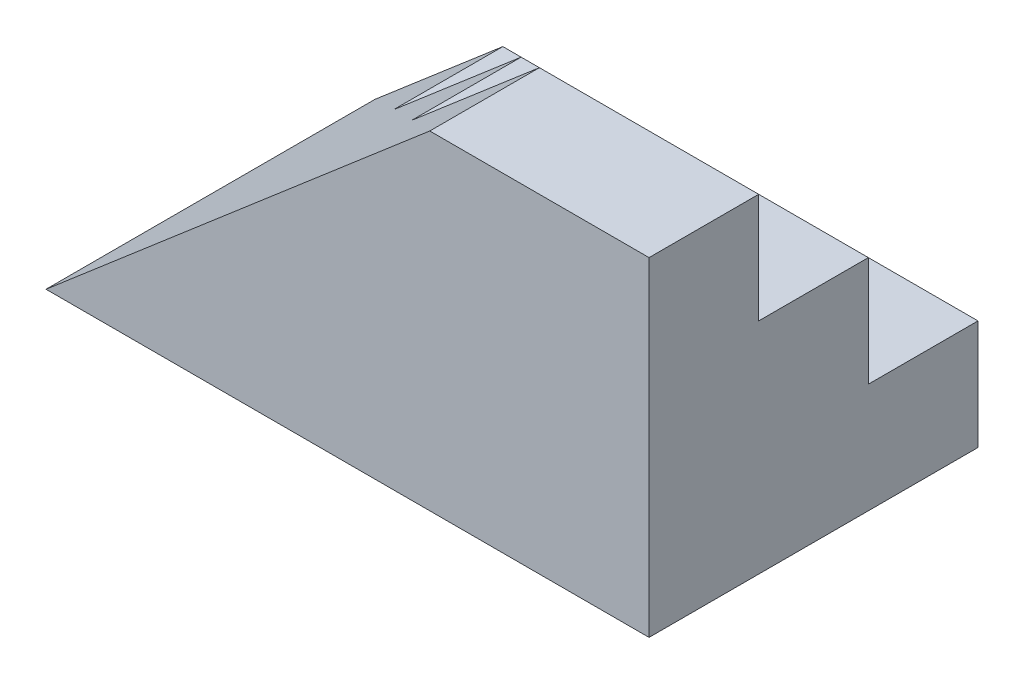
ISO-10303-21;
HEADER;
FILE_DESCRIPTION(('STEP AP214'),'2;1');
FILE_NAME('part.step','',(''),(''),'','','');
FILE_SCHEMA(('AUTOMOTIVE_DESIGN { 1 0 10303 214 1 1 1 1 }'));
ENDSEC;
DATA;
#1=APPLICATION_CONTEXT('core data for automotive mechanical design processes');
#2=APPLICATION_PROTOCOL_DEFINITION('international standard','automotive_design',2000,#1);
#3=PRODUCT_CONTEXT('',#1,'mechanical');
#4=PRODUCT('Part','Part','',(#3));
#5=PRODUCT_RELATED_PRODUCT_CATEGORY('part','',(#4));
#6=PRODUCT_DEFINITION_FORMATION('','',#4);
#7=PRODUCT_DEFINITION_CONTEXT('part definition',#1,'design');
#8=PRODUCT_DEFINITION('design','',#6,#7);
#9=PRODUCT_DEFINITION_SHAPE('','',#8);
#10=(LENGTH_UNIT() NAMED_UNIT(*) SI_UNIT(.MILLI.,.METRE.));
#11=(NAMED_UNIT(*) PLANE_ANGLE_UNIT() SI_UNIT($,.RADIAN.));
#12=(NAMED_UNIT(*) SI_UNIT($,.STERADIAN.) SOLID_ANGLE_UNIT());
#13=UNCERTAINTY_MEASURE_WITH_UNIT(LENGTH_MEASURE(1.E-05),#10,'distance_accuracy_value','');
#14=(GEOMETRIC_REPRESENTATION_CONTEXT(3) GLOBAL_UNCERTAINTY_ASSIGNED_CONTEXT((#13)) GLOBAL_UNIT_ASSIGNED_CONTEXT((#10,
#11,#12)) REPRESENTATION_CONTEXT('',''));
#15=CARTESIAN_POINT('',(0.,0.,0.));
#16=DIRECTION('',(0.,0.,1.));
#17=DIRECTION('',(1.,0.,0.));
#18=AXIS2_PLACEMENT_3D('',#15,#16,#17);
#19=CARTESIAN_POINT('',(110.,60.,0.));
#20=DIRECTION('',(0.,-1.,0.));
#21=DIRECTION('',(0.,0.,-1.));
#22=AXIS2_PLACEMENT_3D('',#19,#20,#21);
#23=PLANE('',#22);
#24=DIRECTION('',(0.,0.,-1.));
#25=VECTOR('',#24,1.);
#26=CARTESIAN_POINT('',(70.,60.,173.655549868123));
#27=LINE('',#26,#25);
#28=CARTESIAN_POINT('',(70.,60.,0.));
#29=VERTEX_POINT('',#28);
#30=CARTESIAN_POINT('',(70.,60.,-20.));
#31=VERTEX_POINT('',#30);
#32=EDGE_CURVE('E54',#29,#31,#27,.T.);
#33=ORIENTED_EDGE('',*,*,#32,.F.);
#34=DIRECTION('',(-1.,0.,0.));
#35=VECTOR('',#34,1.);
#36=CARTESIAN_POINT('',(110.,60.,0.));
#37=LINE('',#36,#35);
#38=CARTESIAN_POINT('',(110.,60.,0.));
#39=VERTEX_POINT('',#38);
#40=EDGE_CURVE('E156',#39,#29,#37,.T.);
#41=ORIENTED_EDGE('',*,*,#40,.F.);
#42=DIRECTION('',(0.,0.,1.));
#43=VECTOR('',#42,1.);
#44=CARTESIAN_POINT('',(110.,60.,0.));
#45=LINE('',#44,#43);
#46=CARTESIAN_POINT('',(110.,60.,-20.));
#47=VERTEX_POINT('',#46);
#48=EDGE_CURVE('E154',#47,#39,#45,.T.);
#49=ORIENTED_EDGE('',*,*,#48,.F.);
#50=DIRECTION('',(-1.,0.,0.));
#51=VECTOR('',#50,1.);
#52=CARTESIAN_POINT('',(110.,60.,-20.));
#53=LINE('',#52,#51);
#54=EDGE_CURVE('E116',#47,#31,#53,.T.);
#55=ORIENTED_EDGE('',*,*,#54,.T.);
#56=EDGE_LOOP('',(#33,#41,#49,#55));
#57=FACE_BOUND('',#56,.T.);
#58=ADVANCED_FACE('F39',(#57),#23,.F.);
#59=CARTESIAN_POINT('',(110.,0.,0.));
#60=DIRECTION('',(0.,0.,-1.));
#61=DIRECTION('',(0.,1.,0.));
#62=AXIS2_PLACEMENT_3D('',#59,#60,#61);
#63=PLANE('',#62);
#64=DIRECTION('',(0.759256602365297,0.650791373455968,0.));
#65=VECTOR('',#64,1.);
#66=CARTESIAN_POINT('',(63.4117647058824,54.3529411764706,0.));
#67=LINE('',#66,#65);
#68=CARTESIAN_POINT('',(0.,0.,0.));
#69=VERTEX_POINT('',#68);
#70=EDGE_CURVE('E130',#69,#29,#67,.T.);
#71=ORIENTED_EDGE('',*,*,#70,.F.);
#72=DIRECTION('',(-1.,0.,0.));
#73=VECTOR('',#72,1.);
#74=CARTESIAN_POINT('',(110.,0.,0.));
#75=LINE('',#74,#73);
#76=CARTESIAN_POINT('',(110.,0.,0.));
#77=VERTEX_POINT('',#76);
#78=EDGE_CURVE('E47',#77,#69,#75,.T.);
#79=ORIENTED_EDGE('',*,*,#78,.F.);
#80=DIRECTION('',(0.,-1.,0.));
#81=VECTOR('',#80,1.);
#82=CARTESIAN_POINT('',(110.,0.,0.));
#83=LINE('',#82,#81);
#84=EDGE_CURVE('E140',#39,#77,#83,.T.);
#85=ORIENTED_EDGE('',*,*,#84,.F.);
#86=ORIENTED_EDGE('',*,*,#40,.T.);
#87=EDGE_LOOP('',(#71,#79,#85,#86));
#88=FACE_BOUND('',#87,.T.);
#89=ADVANCED_FACE('F41',(#88),#63,.F.);
#90=CARTESIAN_POINT('',(110.,20.,-60.));
#91=DIRECTION('',(0.,0.,1.));
#92=DIRECTION('',(0.,-1.,0.));
#93=AXIS2_PLACEMENT_3D('',#90,#91,#92);
#94=PLANE('',#93);
#95=DIRECTION('',(-0.759256602365297,-0.650791373455968,0.));
#96=VECTOR('',#95,1.);
#97=CARTESIAN_POINT('',(73.2941176470588,62.8235294117647,-60.));
#98=LINE('',#97,#96);
#99=CARTESIAN_POINT('',(23.3333333333333,20.,-60.));
#100=VERTEX_POINT('',#99);
#101=CARTESIAN_POINT('',(0.,0.,-60.));
#102=VERTEX_POINT('',#101);
#103=EDGE_CURVE('E62',#100,#102,#98,.T.);
#104=ORIENTED_EDGE('',*,*,#103,.F.);
#105=DIRECTION('',(-1.,0.,0.));
#106=VECTOR('',#105,1.);
#107=CARTESIAN_POINT('',(110.,20.,-60.));
#108=LINE('',#107,#106);
#109=CARTESIAN_POINT('',(110.,20.,-60.));
#110=VERTEX_POINT('',#109);
#111=EDGE_CURVE('E164',#110,#100,#108,.T.);
#112=ORIENTED_EDGE('',*,*,#111,.F.);
#113=DIRECTION('',(0.,1.,0.));
#114=VECTOR('',#113,1.);
#115=CARTESIAN_POINT('',(110.,20.,-60.));
#116=LINE('',#115,#114);
#117=CARTESIAN_POINT('',(110.,0.,-60.));
#118=VERTEX_POINT('',#117);
#119=EDGE_CURVE('E145',#118,#110,#116,.T.);
#120=ORIENTED_EDGE('',*,*,#119,.F.);
#121=DIRECTION('',(-1.,0.,0.));
#122=VECTOR('',#121,1.);
#123=CARTESIAN_POINT('',(110.,0.,-60.));
#124=LINE('',#123,#122);
#125=EDGE_CURVE('E166',#118,#102,#124,.T.);
#126=ORIENTED_EDGE('',*,*,#125,.T.);
#127=EDGE_LOOP('',(#104,#112,#120,#126));
#128=FACE_BOUND('',#127,.T.);
#129=ADVANCED_FACE('F184',(#128),#94,.F.);
#130=CARTESIAN_POINT('',(110.,20.,-40.));
#131=DIRECTION('',(0.,-1.,0.));
#132=DIRECTION('',(0.,0.,-1.));
#133=AXIS2_PLACEMENT_3D('',#130,#131,#132);
#134=PLANE('',#133);
#135=DIRECTION('',(0.,0.,-1.));
#136=VECTOR('',#135,1.);
#137=CARTESIAN_POINT('',(23.3333333333333,20.,-40.));
#138=LINE('',#137,#136);
#139=CARTESIAN_POINT('',(23.3333333333334,20.,-40.));
#140=VERTEX_POINT('',#139);
#141=EDGE_CURVE('E134',#140,#100,#138,.T.);
#142=ORIENTED_EDGE('',*,*,#141,.F.);
#143=DIRECTION('',(-1.,0.,0.));
#144=VECTOR('',#143,1.);
#145=CARTESIAN_POINT('',(110.,20.,-40.));
#146=LINE('',#145,#144);
#147=CARTESIAN_POINT('',(110.,20.,-40.));
#148=VERTEX_POINT('',#147);
#149=EDGE_CURVE('E161',#148,#140,#146,.T.);
#150=ORIENTED_EDGE('',*,*,#149,.F.);
#151=DIRECTION('',(0.,0.,1.));
#152=VECTOR('',#151,1.);
#153=CARTESIAN_POINT('',(110.,20.,-40.));
#154=LINE('',#153,#152);
#155=EDGE_CURVE('E147',#110,#148,#154,.T.);
#156=ORIENTED_EDGE('',*,*,#155,.F.);
#157=ORIENTED_EDGE('',*,*,#111,.T.);
#158=EDGE_LOOP('',(#142,#150,#156,#157));
#159=FACE_BOUND('',#158,.T.);
#160=ADVANCED_FACE('F176',(#159),#134,.F.);
#161=CARTESIAN_POINT('',(110.,40.,-40.));
#162=DIRECTION('',(0.,0.,1.));
#163=DIRECTION('',(0.,-1.,0.));
#164=AXIS2_PLACEMENT_3D('',#161,#162,#163);
#165=PLANE('',#164);
#166=DIRECTION('',(-0.759256602365297,-0.650791373455968,0.));
#167=VECTOR('',#166,1.);
#168=CARTESIAN_POINT('',(83.1764705882353,71.2941176470588,-40.));
#169=LINE('',#168,#167);
#170=CARTESIAN_POINT('',(46.6666666666667,40.,-40.));
#171=VERTEX_POINT('',#170);
#172=EDGE_CURVE('E125',#171,#140,#169,.T.);
#173=ORIENTED_EDGE('',*,*,#172,.F.);
#174=DIRECTION('',(-1.,0.,0.));
#175=VECTOR('',#174,1.);
#176=CARTESIAN_POINT('',(110.,40.,-40.));
#177=LINE('',#176,#175);
#178=CARTESIAN_POINT('',(110.,40.,-40.));
#179=VERTEX_POINT('',#178);
#180=EDGE_CURVE('E115',#179,#171,#177,.T.);
#181=ORIENTED_EDGE('',*,*,#180,.F.);
#182=DIRECTION('',(0.,1.,0.));
#183=VECTOR('',#182,1.);
#184=CARTESIAN_POINT('',(110.,40.,-40.));
#185=LINE('',#184,#183);
#186=EDGE_CURVE('E149',#148,#179,#185,.T.);
#187=ORIENTED_EDGE('',*,*,#186,.F.);
#188=ORIENTED_EDGE('',*,*,#149,.T.);
#189=EDGE_LOOP('',(#173,#181,#187,#188));
#190=FACE_BOUND('',#189,.T.);
#191=ADVANCED_FACE('F180',(#190),#165,.F.);
#192=CARTESIAN_POINT('',(110.,40.,-20.));
#193=DIRECTION('',(0.,-1.,0.));
#194=DIRECTION('',(0.,0.,-1.));
#195=AXIS2_PLACEMENT_3D('',#192,#193,#194);
#196=PLANE('',#195);
#197=DIRECTION('',(0.,0.,-1.));
#198=VECTOR('',#197,1.);
#199=CARTESIAN_POINT('',(46.6666666666667,40.,-20.));
#200=LINE('',#199,#198);
#201=CARTESIAN_POINT('',(46.6666666666667,40.,-20.));
#202=VERTEX_POINT('',#201);
#203=EDGE_CURVE('E120',#202,#171,#200,.T.);
#204=ORIENTED_EDGE('',*,*,#203,.F.);
#205=DIRECTION('',(-1.,0.,0.));
#206=VECTOR('',#205,1.);
#207=CARTESIAN_POINT('',(110.,40.,-20.));
#208=LINE('',#207,#206);
#209=CARTESIAN_POINT('',(110.,40.,-20.));
#210=VERTEX_POINT('',#209);
#211=EDGE_CURVE('E108',#210,#202,#208,.T.);
#212=ORIENTED_EDGE('',*,*,#211,.F.);
#213=DIRECTION('',(0.,0.,1.));
#214=VECTOR('',#213,1.);
#215=CARTESIAN_POINT('',(110.,40.,-20.));
#216=LINE('',#215,#214);
#217=EDGE_CURVE('E151',#179,#210,#216,.T.);
#218=ORIENTED_EDGE('',*,*,#217,.F.);
#219=ORIENTED_EDGE('',*,*,#180,.T.);
#220=EDGE_LOOP('',(#204,#212,#218,#219));
#221=FACE_BOUND('',#220,.T.);
#222=ADVANCED_FACE('F121',(#221),#196,.F.);
#223=CARTESIAN_POINT('',(110.,60.,-20.));
#224=DIRECTION('',(0.,0.,1.));
#225=DIRECTION('',(0.,-1.,0.));
#226=AXIS2_PLACEMENT_3D('',#223,#224,#225);
#227=PLANE('',#226);
#228=DIRECTION('',(-0.759256602365297,-0.650791373455968,0.));
#229=VECTOR('',#228,1.);
#230=CARTESIAN_POINT('',(93.0588235294118,79.7647058823529,-20.));
#231=LINE('',#230,#229);
#232=EDGE_CURVE('E11',#31,#202,#231,.T.);
#233=ORIENTED_EDGE('',*,*,#232,.F.);
#234=ORIENTED_EDGE('',*,*,#54,.F.);
#235=DIRECTION('',(0.,1.,0.));
#236=VECTOR('',#235,1.);
#237=CARTESIAN_POINT('',(110.,60.,-20.));
#238=LINE('',#237,#236);
#239=EDGE_CURVE('E112',#210,#47,#238,.T.);
#240=ORIENTED_EDGE('',*,*,#239,.F.);
#241=ORIENTED_EDGE('',*,*,#211,.T.);
#242=EDGE_LOOP('',(#233,#234,#240,#241));
#243=FACE_BOUND('',#242,.T.);
#244=ADVANCED_FACE('F110',(#243),#227,.F.);
#245=CARTESIAN_POINT('',(110.,0.,0.));
#246=DIRECTION('',(0.,1.,0.));
#247=DIRECTION('',(0.,0.,1.));
#248=AXIS2_PLACEMENT_3D('',#245,#246,#247);
#249=PLANE('',#248);
#250=DIRECTION('',(0.,0.,-1.));
#251=VECTOR('',#250,1.);
#252=CARTESIAN_POINT('',(0.,0.,0.));
#253=LINE('',#252,#251);
#254=EDGE_CURVE('E139',#69,#102,#253,.T.);
#255=ORIENTED_EDGE('',*,*,#254,.T.);
#256=ORIENTED_EDGE('',*,*,#125,.F.);
#257=DIRECTION('',(0.,0.,-1.));
#258=VECTOR('',#257,1.);
#259=CARTESIAN_POINT('',(110.,0.,0.));
#260=LINE('',#259,#258);
#261=EDGE_CURVE('E143',#77,#118,#260,.T.);
#262=ORIENTED_EDGE('',*,*,#261,.F.);
#263=ORIENTED_EDGE('',*,*,#78,.T.);
#264=EDGE_LOOP('',(#255,#256,#262,#263));
#265=FACE_BOUND('',#264,.T.);
#266=ADVANCED_FACE('F170',(#265),#249,.F.);
#267=CARTESIAN_POINT('',(110.,0.,0.));
#268=DIRECTION('',(-1.,0.,0.));
#269=DIRECTION('',(0.,0.,1.));
#270=AXIS2_PLACEMENT_3D('',#267,#268,#269);
#271=PLANE('',#270);
#272=ORIENTED_EDGE('',*,*,#84,.T.);
#273=ORIENTED_EDGE('',*,*,#261,.T.);
#274=ORIENTED_EDGE('',*,*,#119,.T.);
#275=ORIENTED_EDGE('',*,*,#155,.T.);
#276=ORIENTED_EDGE('',*,*,#186,.T.);
#277=ORIENTED_EDGE('',*,*,#217,.T.);
#278=ORIENTED_EDGE('',*,*,#239,.T.);
#279=ORIENTED_EDGE('',*,*,#48,.T.);
#280=EDGE_LOOP('',(#272,#273,#274,#275,#276,#277,#278,#279));
#281=FACE_BOUND('',#280,.T.);
#282=ADVANCED_FACE('F182',(#281),#271,.F.);
#283=CARTESIAN_POINT('',(0.,0.,173.655549868123));
#284=DIRECTION('',(-0.650791373455968,0.759256602365297,0.));
#285=DIRECTION('',(-0.759256602365297,-0.650791373455968,0.));
#286=AXIS2_PLACEMENT_3D('',#283,#284,#285);
#287=PLANE('',#286);
#288=ORIENTED_EDGE('',*,*,#254,.F.);
#289=ORIENTED_EDGE('',*,*,#70,.T.);
#290=ORIENTED_EDGE('',*,*,#32,.T.);
#291=ORIENTED_EDGE('',*,*,#232,.T.);
#292=ORIENTED_EDGE('',*,*,#203,.T.);
#293=ORIENTED_EDGE('',*,*,#172,.T.);
#294=ORIENTED_EDGE('',*,*,#141,.T.);
#295=ORIENTED_EDGE('',*,*,#103,.T.);
#296=EDGE_LOOP('',(#288,#289,#290,#291,#292,#293,#294,#295));
#297=FACE_BOUND('',#296,.T.);
#298=ADVANCED_FACE('F128',(#297),#287,.T.);
#299=CLOSED_SHELL('',(#58,#89,#129,#160,#191,#222,#244,#266,#282,#298));
#300=MANIFOLD_SOLID_BREP('B2',#299);
#301=ADVANCED_BREP_SHAPE_REPRESENTATION('',(#18,#300),#14);
#302=SHAPE_DEFINITION_REPRESENTATION(#9,#301);
ENDSEC;
END-ISO-10303-21;
